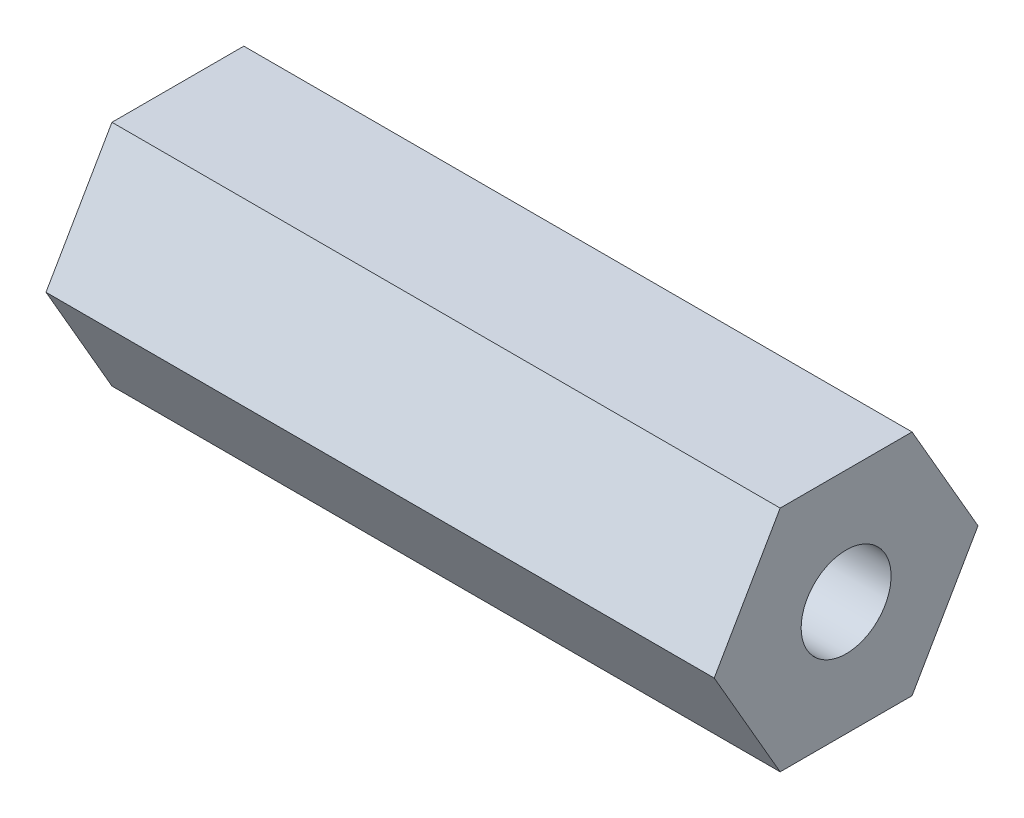
ISO-10303-21;
HEADER;
FILE_DESCRIPTION(('STEP AP214'),'2;1');
FILE_NAME('part.step','',(''),(''),'','','');
FILE_SCHEMA(('AUTOMOTIVE_DESIGN { 1 0 10303 214 1 1 1 1 }'));
ENDSEC;
DATA;
#1=APPLICATION_CONTEXT('core data for automotive mechanical design processes');
#2=APPLICATION_PROTOCOL_DEFINITION('international standard','automotive_design',2000,#1);
#3=PRODUCT_CONTEXT('',#1,'mechanical');
#4=PRODUCT('Part','Part','',(#3));
#5=PRODUCT_RELATED_PRODUCT_CATEGORY('part','',(#4));
#6=PRODUCT_DEFINITION_FORMATION('','',#4);
#7=PRODUCT_DEFINITION_CONTEXT('part definition',#1,'design');
#8=PRODUCT_DEFINITION('design','',#6,#7);
#9=PRODUCT_DEFINITION_SHAPE('','',#8);
#10=(LENGTH_UNIT() NAMED_UNIT(*) SI_UNIT(.MILLI.,.METRE.));
#11=(NAMED_UNIT(*) PLANE_ANGLE_UNIT() SI_UNIT($,.RADIAN.));
#12=(NAMED_UNIT(*) SI_UNIT($,.STERADIAN.) SOLID_ANGLE_UNIT());
#13=UNCERTAINTY_MEASURE_WITH_UNIT(LENGTH_MEASURE(1.E-05),#10,'distance_accuracy_value','');
#14=(GEOMETRIC_REPRESENTATION_CONTEXT(3) GLOBAL_UNCERTAINTY_ASSIGNED_CONTEXT((#13)) GLOBAL_UNIT_ASSIGNED_CONTEXT((#10,
#11,#12)) REPRESENTATION_CONTEXT('',''));
#15=CARTESIAN_POINT('',(0.,0.,0.));
#16=DIRECTION('',(0.,0.,1.));
#17=DIRECTION('',(1.,0.,0.));
#18=AXIS2_PLACEMENT_3D('',#15,#16,#17);
#19=CARTESIAN_POINT('',(18.575,-6.34999999999993,-3.66617420935418));
#20=DIRECTION('',(0.,0.499999999999995,0.866025403784441));
#21=DIRECTION('',(0.,-0.866025403784442,0.499999999999995));
#22=AXIS2_PLACEMENT_3D('',#19,#20,#21);
#23=PLANE('',#22);
#24=DIRECTION('',(0.,0.866025403784442,-0.499999999999995));
#25=VECTOR('',#24,1.);
#26=CARTESIAN_POINT('',(-18.575,-6.34999999999993,-3.66617420935418));
#27=LINE('',#26,#25);
#28=CARTESIAN_POINT('',(-18.575,-6.34999999999993,-3.66617420935418));
#29=VERTEX_POINT('',#28);
#30=CARTESIAN_POINT('',(-18.575,0.,-7.33234841870822));
#31=VERTEX_POINT('',#30);
#32=EDGE_CURVE('E121',#29,#31,#27,.T.);
#33=ORIENTED_EDGE('',*,*,#32,.T.);
#34=DIRECTION('',(-1.,0.,0.));
#35=VECTOR('',#34,1.);
#36=CARTESIAN_POINT('',(18.575,0.,-7.33234841870822));
#37=LINE('',#36,#35);
#38=CARTESIAN_POINT('',(18.575,0.,-7.33234841870822));
#39=VERTEX_POINT('',#38);
#40=EDGE_CURVE('E11',#39,#31,#37,.T.);
#41=ORIENTED_EDGE('',*,*,#40,.F.);
#42=DIRECTION('',(0.,0.866025403784442,-0.499999999999995));
#43=VECTOR('',#42,1.);
#44=CARTESIAN_POINT('',(18.575,-6.34999999999993,-3.66617420935418));
#45=LINE('',#44,#43);
#46=CARTESIAN_POINT('',(18.575,-6.34999999999993,-3.66617420935418));
#47=VERTEX_POINT('',#46);
#48=EDGE_CURVE('E132',#47,#39,#45,.T.);
#49=ORIENTED_EDGE('',*,*,#48,.F.);
#50=DIRECTION('',(-1.,0.,0.));
#51=VECTOR('',#50,1.);
#52=CARTESIAN_POINT('',(18.575,-6.34999999999993,-3.66617420935418));
#53=LINE('',#52,#51);
#54=EDGE_CURVE('E117',#47,#29,#53,.T.);
#55=ORIENTED_EDGE('',*,*,#54,.T.);
#56=EDGE_LOOP('',(#33,#41,#49,#55));
#57=FACE_BOUND('',#56,.T.);
#58=ADVANCED_FACE('F37',(#57),#23,.F.);
#59=CARTESIAN_POINT('',(18.575,0.,-7.33234841870822));
#60=DIRECTION('',(0.,-0.500000000000001,0.866025403784438));
#61=DIRECTION('',(0.,-0.866025403784438,-0.500000000000001));
#62=AXIS2_PLACEMENT_3D('',#59,#60,#61);
#63=PLANE('',#62);
#64=DIRECTION('',(0.,0.866025403784438,0.500000000000001));
#65=VECTOR('',#64,1.);
#66=CARTESIAN_POINT('',(-18.575,0.,-7.33234841870822));
#67=LINE('',#66,#65);
#68=CARTESIAN_POINT('',(-18.575,6.34999999999999,-3.6661742093541));
#69=VERTEX_POINT('',#68);
#70=EDGE_CURVE('E124',#31,#69,#67,.T.);
#71=ORIENTED_EDGE('',*,*,#70,.T.);
#72=DIRECTION('',(-1.,0.,0.));
#73=VECTOR('',#72,1.);
#74=CARTESIAN_POINT('',(18.575,6.34999999999999,-3.6661742093541));
#75=LINE('',#74,#73);
#76=CARTESIAN_POINT('',(18.575,6.34999999999999,-3.6661742093541));
#77=VERTEX_POINT('',#76);
#78=EDGE_CURVE('E45',#77,#69,#75,.T.);
#79=ORIENTED_EDGE('',*,*,#78,.F.);
#80=DIRECTION('',(0.,0.866025403784438,0.500000000000001));
#81=VECTOR('',#80,1.);
#82=CARTESIAN_POINT('',(18.575,0.,-7.33234841870822));
#83=LINE('',#82,#81);
#84=EDGE_CURVE('E90',#39,#77,#83,.T.);
#85=ORIENTED_EDGE('',*,*,#84,.F.);
#86=ORIENTED_EDGE('',*,*,#40,.T.);
#87=EDGE_LOOP('',(#71,#79,#85,#86));
#88=FACE_BOUND('',#87,.T.);
#89=ADVANCED_FACE('F157',(#88),#63,.F.);
#90=CARTESIAN_POINT('',(18.575,6.34999999999999,-3.6661742093541));
#91=DIRECTION('',(0.,-1.,0.));
#92=DIRECTION('',(0.,0.,-1.));
#93=AXIS2_PLACEMENT_3D('',#90,#91,#92);
#94=PLANE('',#93);
#95=DIRECTION('',(0.,0.,1.));
#96=VECTOR('',#95,1.);
#97=CARTESIAN_POINT('',(-18.575,6.34999999999999,-3.6661742093541));
#98=LINE('',#97,#96);
#99=CARTESIAN_POINT('',(-18.575,6.34999999999996,3.66617420935414));
#100=VERTEX_POINT('',#99);
#101=EDGE_CURVE('E127',#69,#100,#98,.T.);
#102=ORIENTED_EDGE('',*,*,#101,.T.);
#103=DIRECTION('',(-1.,0.,0.));
#104=VECTOR('',#103,1.);
#105=CARTESIAN_POINT('',(18.575,6.34999999999996,3.66617420935414));
#106=LINE('',#105,#104);
#107=CARTESIAN_POINT('',(18.575,6.34999999999996,3.66617420935414));
#108=VERTEX_POINT('',#107);
#109=EDGE_CURVE('E112',#108,#100,#106,.T.);
#110=ORIENTED_EDGE('',*,*,#109,.F.);
#111=DIRECTION('',(0.,0.,1.));
#112=VECTOR('',#111,1.);
#113=CARTESIAN_POINT('',(18.575,6.34999999999999,-3.6661742093541));
#114=LINE('',#113,#112);
#115=EDGE_CURVE('E103',#77,#108,#114,.T.);
#116=ORIENTED_EDGE('',*,*,#115,.F.);
#117=ORIENTED_EDGE('',*,*,#78,.T.);
#118=EDGE_LOOP('',(#102,#110,#116,#117));
#119=FACE_BOUND('',#118,.T.);
#120=ADVANCED_FACE('F138',(#119),#94,.F.);
#121=CARTESIAN_POINT('',(18.575,6.34999999999996,3.66617420935414));
#122=DIRECTION('',(0.,-0.499999999999995,-0.866025403784441));
#123=DIRECTION('',(0.,0.866025403784442,-0.499999999999995));
#124=AXIS2_PLACEMENT_3D('',#121,#122,#123);
#125=PLANE('',#124);
#126=DIRECTION('',(0.,-0.866025403784441,0.499999999999995));
#127=VECTOR('',#126,1.);
#128=CARTESIAN_POINT('',(-18.575,6.34999999999996,3.66617420935414));
#129=LINE('',#128,#127);
#130=CARTESIAN_POINT('',(-18.575,0.,7.33234841870822));
#131=VERTEX_POINT('',#130);
#132=EDGE_CURVE('E111',#100,#131,#129,.T.);
#133=ORIENTED_EDGE('',*,*,#132,.T.);
#134=DIRECTION('',(-1.,0.,0.));
#135=VECTOR('',#134,1.);
#136=CARTESIAN_POINT('',(18.575,0.,7.33234841870822));
#137=LINE('',#136,#135);
#138=CARTESIAN_POINT('',(18.575,0.,7.33234841870822));
#139=VERTEX_POINT('',#138);
#140=EDGE_CURVE('E108',#139,#131,#137,.T.);
#141=ORIENTED_EDGE('',*,*,#140,.F.);
#142=DIRECTION('',(0.,-0.866025403784441,0.499999999999995));
#143=VECTOR('',#142,1.);
#144=CARTESIAN_POINT('',(18.575,6.34999999999996,3.66617420935414));
#145=LINE('',#144,#143);
#146=EDGE_CURVE('E97',#108,#139,#145,.T.);
#147=ORIENTED_EDGE('',*,*,#146,.F.);
#148=ORIENTED_EDGE('',*,*,#109,.T.);
#149=EDGE_LOOP('',(#133,#141,#147,#148));
#150=FACE_BOUND('',#149,.T.);
#151=ADVANCED_FACE('F109',(#150),#125,.F.);
#152=CARTESIAN_POINT('',(18.575,0.,7.33234841870822));
#153=DIRECTION('',(0.,0.500000000000007,-0.866025403784435));
#154=DIRECTION('',(0.,0.866025403784435,0.500000000000007));
#155=AXIS2_PLACEMENT_3D('',#152,#153,#154);
#156=PLANE('',#155);
#157=DIRECTION('',(0.,-0.866025403784435,-0.500000000000007));
#158=VECTOR('',#157,1.);
#159=CARTESIAN_POINT('',(-18.575,0.,7.33234841870822));
#160=LINE('',#159,#158);
#161=CARTESIAN_POINT('',(-18.575,-6.35000000000001,3.66617420935405));
#162=VERTEX_POINT('',#161);
#163=EDGE_CURVE('E76',#131,#162,#160,.T.);
#164=ORIENTED_EDGE('',*,*,#163,.T.);
#165=DIRECTION('',(-1.,0.,0.));
#166=VECTOR('',#165,1.);
#167=CARTESIAN_POINT('',(18.575,-6.35000000000001,3.66617420935405));
#168=LINE('',#167,#166);
#169=CARTESIAN_POINT('',(18.575,-6.35000000000001,3.66617420935405));
#170=VERTEX_POINT('',#169);
#171=EDGE_CURVE('E113',#170,#162,#168,.T.);
#172=ORIENTED_EDGE('',*,*,#171,.F.);
#173=DIRECTION('',(0.,-0.866025403784435,-0.500000000000007));
#174=VECTOR('',#173,1.);
#175=CARTESIAN_POINT('',(18.575,0.,7.33234841870822));
#176=LINE('',#175,#174);
#177=EDGE_CURVE('E101',#139,#170,#176,.T.);
#178=ORIENTED_EDGE('',*,*,#177,.F.);
#179=ORIENTED_EDGE('',*,*,#140,.T.);
#180=EDGE_LOOP('',(#164,#172,#178,#179));
#181=FACE_BOUND('',#180,.T.);
#182=ADVANCED_FACE('F115',(#181),#156,.F.);
#183=CARTESIAN_POINT('',(18.575,-6.35000000000001,3.66617420935405));
#184=DIRECTION('',(0.,1.,0.));
#185=DIRECTION('',(0.,0.,1.));
#186=AXIS2_PLACEMENT_3D('',#183,#184,#185);
#187=PLANE('',#186);
#188=DIRECTION('',(0.,0.,-1.));
#189=VECTOR('',#188,1.);
#190=CARTESIAN_POINT('',(-18.575,-6.35000000000001,3.66617420935405));
#191=LINE('',#190,#189);
#192=EDGE_CURVE('E82',#162,#29,#191,.T.);
#193=ORIENTED_EDGE('',*,*,#192,.T.);
#194=ORIENTED_EDGE('',*,*,#54,.F.);
#195=DIRECTION('',(0.,0.,-1.));
#196=VECTOR('',#195,1.);
#197=CARTESIAN_POINT('',(18.575,-6.35000000000001,3.66617420935405));
#198=LINE('',#197,#196);
#199=EDGE_CURVE('E53',#170,#47,#198,.T.);
#200=ORIENTED_EDGE('',*,*,#199,.F.);
#201=ORIENTED_EDGE('',*,*,#171,.T.);
#202=EDGE_LOOP('',(#193,#194,#200,#201));
#203=FACE_BOUND('',#202,.T.);
#204=ADVANCED_FACE('F145',(#203),#187,.F.);
#205=CARTESIAN_POINT('',(18.575,0.,0.));
#206=DIRECTION('',(1.,0.,0.));
#207=DIRECTION('',(0.,0.,-1.));
#208=AXIS2_PLACEMENT_3D('',#205,#206,#207);
#209=PLANE('',#208);
#210=CARTESIAN_POINT('',(18.575,0.,0.));
#211=DIRECTION('',(-1.,0.,0.));
#212=DIRECTION('',(0.,0.,1.));
#213=AXIS2_PLACEMENT_3D('',#210,#211,#212);
#214=CIRCLE('',#213,2.5);
#215=CARTESIAN_POINT('',(18.575,0.,2.5));
#216=VERTEX_POINT('',#215);
#217=EDGE_CURVE('E125',#216,#216,#214,.T.);
#218=ORIENTED_EDGE('',*,*,#217,.T.);
#219=EDGE_LOOP('',(#218));
#220=FACE_BOUND('',#219,.T.);
#221=ORIENTED_EDGE('',*,*,#48,.T.);
#222=ORIENTED_EDGE('',*,*,#84,.T.);
#223=ORIENTED_EDGE('',*,*,#115,.T.);
#224=ORIENTED_EDGE('',*,*,#146,.T.);
#225=ORIENTED_EDGE('',*,*,#177,.T.);
#226=ORIENTED_EDGE('',*,*,#199,.T.);
#227=EDGE_LOOP('',(#221,#222,#223,#224,#225,#226));
#228=FACE_BOUND('',#227,.T.);
#229=ADVANCED_FACE('F99',(#220,#228),#209,.T.);
#230=CARTESIAN_POINT('',(-18.575,0.,0.));
#231=DIRECTION('',(1.,0.,0.));
#232=DIRECTION('',(0.,0.,-1.));
#233=AXIS2_PLACEMENT_3D('',#230,#231,#232);
#234=PLANE('',#233);
#235=CARTESIAN_POINT('',(-18.575,0.,0.));
#236=DIRECTION('',(-1.,0.,0.));
#237=DIRECTION('',(0.,0.,1.));
#238=AXIS2_PLACEMENT_3D('',#235,#236,#237);
#239=CIRCLE('',#238,2.5);
#240=CARTESIAN_POINT('',(-18.575,0.,2.5));
#241=VERTEX_POINT('',#240);
#242=EDGE_CURVE('E236',#241,#241,#239,.T.);
#243=ORIENTED_EDGE('',*,*,#242,.F.);
#244=EDGE_LOOP('',(#243));
#245=FACE_BOUND('',#244,.T.);
#246=ORIENTED_EDGE('',*,*,#32,.F.);
#247=ORIENTED_EDGE('',*,*,#192,.F.);
#248=ORIENTED_EDGE('',*,*,#163,.F.);
#249=ORIENTED_EDGE('',*,*,#132,.F.);
#250=ORIENTED_EDGE('',*,*,#101,.F.);
#251=ORIENTED_EDGE('',*,*,#70,.F.);
#252=EDGE_LOOP('',(#246,#247,#248,#249,#250,#251));
#253=FACE_BOUND('',#252,.T.);
#254=ADVANCED_FACE('F141',(#245,#253),#234,.F.);
#255=CARTESIAN_POINT('',(18.575,0.,0.));
#256=DIRECTION('',(-1.,0.,0.));
#257=DIRECTION('',(0.,0.,1.));
#258=AXIS2_PLACEMENT_3D('',#255,#256,#257);
#259=CYLINDRICAL_SURFACE('',#258,2.5);
#260=CARTESIAN_POINT('',(18.575,0.,2.5));
#261=CARTESIAN_POINT('',(18.1880208333333,0.,2.5));
#262=CARTESIAN_POINT('',(17.8010416666667,0.,2.5));
#263=CARTESIAN_POINT('',(17.0270833333333,0.,2.5));
#264=CARTESIAN_POINT('',(16.6401041666667,0.,2.5));
#265=CARTESIAN_POINT('',(15.8661458333333,0.,2.5));
#266=CARTESIAN_POINT('',(15.4791666666667,0.,2.5));
#267=CARTESIAN_POINT('',(14.7052083333333,0.,2.5));
#268=CARTESIAN_POINT('',(14.3182291666667,0.,2.5));
#269=CARTESIAN_POINT('',(13.5442708333333,0.,2.5));
#270=CARTESIAN_POINT('',(13.1572916666667,0.,2.5));
#271=CARTESIAN_POINT('',(12.3833333333333,0.,2.5));
#272=CARTESIAN_POINT('',(11.9963541666667,0.,2.5));
#273=CARTESIAN_POINT('',(11.2223958333333,0.,2.5));
#274=CARTESIAN_POINT('',(10.8354166666667,0.,2.5));
#275=CARTESIAN_POINT('',(10.0614583333333,0.,2.5));
#276=CARTESIAN_POINT('',(9.67447916666667,0.,2.5));
#277=CARTESIAN_POINT('',(8.90052083333334,0.,2.5));
#278=CARTESIAN_POINT('',(8.51354166666667,0.,2.5));
#279=CARTESIAN_POINT('',(7.73958333333334,0.,2.5));
#280=CARTESIAN_POINT('',(7.35260416666667,0.,2.5));
#281=CARTESIAN_POINT('',(6.57864583333334,0.,2.5));
#282=CARTESIAN_POINT('',(6.19166666666667,0.,2.5));
#283=CARTESIAN_POINT('',(5.41770833333334,0.,2.5));
#284=CARTESIAN_POINT('',(5.03072916666667,0.,2.5));
#285=CARTESIAN_POINT('',(4.25677083333334,0.,2.5));
#286=CARTESIAN_POINT('',(3.86979166666667,0.,2.5));
#287=CARTESIAN_POINT('',(3.09583333333334,0.,2.5));
#288=CARTESIAN_POINT('',(2.70885416666667,0.,2.5));
#289=CARTESIAN_POINT('',(1.93489583333334,0.,2.5));
#290=CARTESIAN_POINT('',(1.54791666666667,0.,2.5));
#291=CARTESIAN_POINT('',(0.773958333333337,0.,2.5));
#292=CARTESIAN_POINT('',(0.38697916666667,0.,2.5));
#293=CARTESIAN_POINT('',(-0.386979166666663,0.,2.5));
#294=CARTESIAN_POINT('',(-0.77395833333333,0.,2.5));
#295=CARTESIAN_POINT('',(-1.54791666666666,0.,2.5));
#296=CARTESIAN_POINT('',(-1.93489583333333,0.,2.5));
#297=CARTESIAN_POINT('',(-2.70885416666666,0.,2.5));
#298=CARTESIAN_POINT('',(-3.09583333333333,0.,2.5));
#299=CARTESIAN_POINT('',(-3.86979166666666,0.,2.5));
#300=CARTESIAN_POINT('',(-4.25677083333333,0.,2.5));
#301=CARTESIAN_POINT('',(-5.03072916666666,0.,2.5));
#302=CARTESIAN_POINT('',(-5.41770833333333,0.,2.5));
#303=CARTESIAN_POINT('',(-6.19166666666666,0.,2.5));
#304=CARTESIAN_POINT('',(-6.57864583333333,0.,2.5));
#305=CARTESIAN_POINT('',(-7.35260416666666,0.,2.5));
#306=CARTESIAN_POINT('',(-7.73958333333333,0.,2.5));
#307=CARTESIAN_POINT('',(-8.51354166666666,0.,2.5));
#308=CARTESIAN_POINT('',(-8.90052083333333,0.,2.5));
#309=CARTESIAN_POINT('',(-9.67447916666666,0.,2.5));
#310=CARTESIAN_POINT('',(-10.0614583333333,0.,2.5));
#311=CARTESIAN_POINT('',(-10.8354166666667,0.,2.5));
#312=CARTESIAN_POINT('',(-11.2223958333333,0.,2.5));
#313=CARTESIAN_POINT('',(-11.9963541666667,0.,2.5));
#314=CARTESIAN_POINT('',(-12.3833333333333,0.,2.5));
#315=CARTESIAN_POINT('',(-13.1572916666667,0.,2.5));
#316=CARTESIAN_POINT('',(-13.5442708333333,0.,2.5));
#317=CARTESIAN_POINT('',(-14.3182291666667,0.,2.5));
#318=CARTESIAN_POINT('',(-14.7052083333333,0.,2.5));
#319=CARTESIAN_POINT('',(-15.4791666666667,0.,2.5));
#320=CARTESIAN_POINT('',(-15.8661458333333,0.,2.5));
#321=CARTESIAN_POINT('',(-16.6401041666667,0.,2.5));
#322=CARTESIAN_POINT('',(-17.0270833333333,0.,2.5));
#323=CARTESIAN_POINT('',(-17.8010416666667,0.,2.5));
#324=CARTESIAN_POINT('',(-18.1880208333333,0.,2.5));
#325=CARTESIAN_POINT('',(-18.575,0.,2.5));
#326=B_SPLINE_CURVE_WITH_KNOTS('',3,(#260,#261,#262,#263,#264,#265,#266,#267,#268,#269,#270,
#271,#272,#273,#274,#275,#276,#277,#278,#279,#280,#281,#282,#283,#284,#285,#286,#287,#288,#289,
#290,#291,#292,#293,#294,#295,#296,#297,#298,#299,#300,#301,#302,#303,#304,#305,#306,#307,#308,
#309,#310,#311,#312,#313,#314,#315,#316,#317,#318,#319,#320,#321,#322,#323,#324,#325),
.UNSPECIFIED.,.F.,.F.,(4,2,2,2,2,2,2,2,2,2,2,2,2,2,2,2,2,2,2,2,2,2,2,2,2,2,2,2,2,2,2,2,4),(0.,
1.1609375,2.321875,3.4828125,4.64375,5.8046875,6.965625,8.1265625,9.2875,10.4484375,11.609375,
12.7703125,13.93125,15.0921875,16.253125,17.4140625,18.575,19.7359375,20.896875,22.0578125,
23.21875,24.3796875,25.540625,26.7015625,27.8625,29.0234375,30.184375,31.3453125,32.50625,
33.6671875,34.828125,35.9890625,37.15),.UNSPECIFIED.);
#327=EDGE_CURVE('BSEAM218',#216,#241,#326,.T.);
#328=ORIENTED_EDGE('',*,*,#217,.F.);
#329=ORIENTED_EDGE('',*,*,#242,.T.);
#330=ORIENTED_EDGE('',*,*,#327,.T.);
#331=ORIENTED_EDGE('',*,*,#327,.F.);
#332=EDGE_LOOP('',(#328,#330,#329,#331));
#333=FACE_BOUND('',#332,.T.);
#334=ADVANCED_FACE('F218',(#333),#259,.F.);
#335=CLOSED_SHELL('',(#58,#89,#120,#151,#182,#204,#229,#254,#334));
#336=MANIFOLD_SOLID_BREP('B2',#335);
#337=ADVANCED_BREP_SHAPE_REPRESENTATION('',(#18,#336),#14);
#338=SHAPE_DEFINITION_REPRESENTATION(#9,#337);
ENDSEC;
END-ISO-10303-21;
